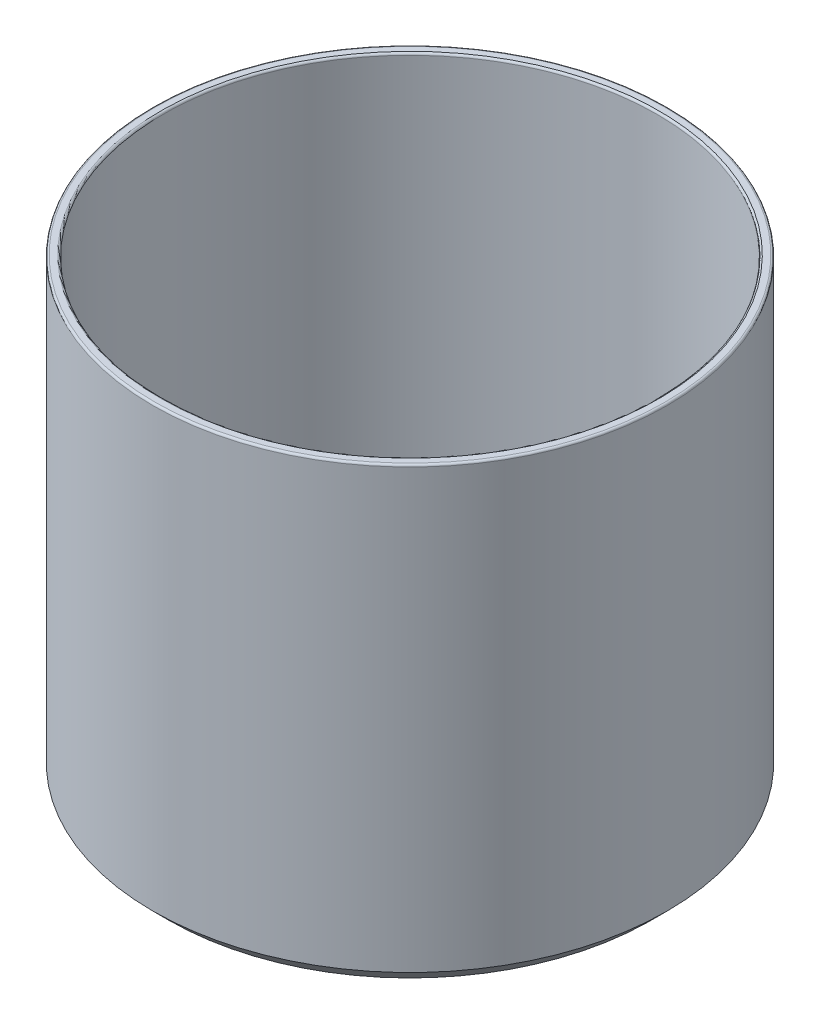
ISO-10303-21;
HEADER;
FILE_DESCRIPTION(('STEP AP214'),'2;1');
FILE_NAME('part.step','',(''),(''),'','','');
FILE_SCHEMA(('AUTOMOTIVE_DESIGN { 1 0 10303 214 1 1 1 1 }'));
ENDSEC;
DATA;
#1=APPLICATION_CONTEXT('core data for automotive mechanical design processes');
#2=APPLICATION_PROTOCOL_DEFINITION('international standard','automotive_design',2000,#1);
#3=PRODUCT_CONTEXT('',#1,'mechanical');
#4=PRODUCT('Part','Part','',(#3));
#5=PRODUCT_RELATED_PRODUCT_CATEGORY('part','',(#4));
#6=PRODUCT_DEFINITION_FORMATION('','',#4);
#7=PRODUCT_DEFINITION_CONTEXT('part definition',#1,'design');
#8=PRODUCT_DEFINITION('design','',#6,#7);
#9=PRODUCT_DEFINITION_SHAPE('','',#8);
#10=(LENGTH_UNIT() NAMED_UNIT(*) SI_UNIT(.MILLI.,.METRE.));
#11=(NAMED_UNIT(*) PLANE_ANGLE_UNIT() SI_UNIT($,.RADIAN.));
#12=(NAMED_UNIT(*) SI_UNIT($,.STERADIAN.) SOLID_ANGLE_UNIT());
#13=UNCERTAINTY_MEASURE_WITH_UNIT(LENGTH_MEASURE(1.E-05),#10,'distance_accuracy_value','');
#14=(GEOMETRIC_REPRESENTATION_CONTEXT(3) GLOBAL_UNCERTAINTY_ASSIGNED_CONTEXT((#13)) GLOBAL_UNIT_ASSIGNED_CONTEXT((#10,
#11,#12)) REPRESENTATION_CONTEXT('',''));
#15=CARTESIAN_POINT('',(0.,0.,0.));
#16=DIRECTION('',(0.,0.,1.));
#17=DIRECTION('',(1.,0.,0.));
#18=AXIS2_PLACEMENT_3D('',#15,#16,#17);
#19=CARTESIAN_POINT('',(0.,6.,0.));
#20=DIRECTION('',(0.,-1.,0.));
#21=DIRECTION('',(0.,0.,-1.));
#22=AXIS2_PLACEMENT_3D('',#19,#20,#21);
#23=CYLINDRICAL_SURFACE('',#22,127.5);
#24=CARTESIAN_POINT('',(0.,225.,0.));
#25=DIRECTION('',(0.,1.,0.));
#26=DIRECTION('',(0.,0.,1.));
#27=AXIS2_PLACEMENT_3D('',#24,#25,#26);
#28=CIRCLE('',#27,127.5);
#29=CARTESIAN_POINT('',(0.,225.,127.5));
#30=VERTEX_POINT('',#29);
#31=EDGE_CURVE('E58',#30,#30,#28,.F.);
#32=ORIENTED_EDGE('',*,*,#31,.T.);
#33=EDGE_LOOP('',(#32));
#34=FACE_BOUND('',#33,.T.);
#35=CARTESIAN_POINT('',(0.,8.00000000000001,0.));
#36=DIRECTION('',(0.,1.,0.));
#37=DIRECTION('',(0.,0.,1.));
#38=AXIS2_PLACEMENT_3D('',#35,#36,#37);
#39=CIRCLE('',#38,127.5);
#40=CARTESIAN_POINT('',(0.,8.00000000000001,127.5));
#41=VERTEX_POINT('',#40);
#42=EDGE_CURVE('E70',#41,#41,#39,.T.);
#43=ORIENTED_EDGE('',*,*,#42,.T.);
#44=EDGE_LOOP('',(#43));
#45=FACE_BOUND('',#44,.T.);
#46=ADVANCED_FACE('F35',(#34,#45),#23,.T.);
#47=CARTESIAN_POINT('',(0.,0.,0.));
#48=DIRECTION('',(0.,1.,0.));
#49=DIRECTION('',(0.,0.,1.));
#50=AXIS2_PLACEMENT_3D('',#47,#48,#49);
#51=PLANE('',#50);
#52=CARTESIAN_POINT('',(0.,0.,0.));
#53=DIRECTION('',(0.,1.,0.));
#54=DIRECTION('',(0.,0.,1.));
#55=AXIS2_PLACEMENT_3D('',#52,#53,#54);
#56=CIRCLE('',#55,11.);
#57=CARTESIAN_POINT('',(0.,0.,11.));
#58=VERTEX_POINT('',#57);
#59=EDGE_CURVE('E50',#58,#58,#56,.T.);
#60=ORIENTED_EDGE('',*,*,#59,.T.);
#61=EDGE_LOOP('',(#60));
#62=FACE_BOUND('',#61,.T.);
#63=CARTESIAN_POINT('',(0.,0.,0.));
#64=DIRECTION('',(0.,1.,0.));
#65=DIRECTION('',(0.,0.,1.));
#66=AXIS2_PLACEMENT_3D('',#63,#64,#65);
#67=CIRCLE('',#66,119.5);
#68=CARTESIAN_POINT('',(0.,0.,119.5));
#69=VERTEX_POINT('',#68);
#70=EDGE_CURVE('E67',#69,#69,#67,.F.);
#71=ORIENTED_EDGE('',*,*,#70,.T.);
#72=EDGE_LOOP('',(#71));
#73=FACE_BOUND('',#72,.T.);
#74=ADVANCED_FACE('F100',(#62,#73),#51,.F.);
#75=CARTESIAN_POINT('',(0.,226.,0.));
#76=DIRECTION('',(0.,1.,0.));
#77=DIRECTION('',(0.,0.,1.));
#78=AXIS2_PLACEMENT_3D('',#75,#76,#77);
#79=PLANE('',#78);
#80=CARTESIAN_POINT('',(0.,226.,0.));
#81=DIRECTION('',(0.,1.,0.));
#82=DIRECTION('',(0.,0.,1.));
#83=AXIS2_PLACEMENT_3D('',#80,#81,#82);
#84=CIRCLE('',#83,126.5);
#85=CARTESIAN_POINT('',(0.,226.,126.5));
#86=VERTEX_POINT('',#85);
#87=EDGE_CURVE('E61',#86,#86,#84,.T.);
#88=ORIENTED_EDGE('',*,*,#87,.T.);
#89=EDGE_LOOP('',(#88));
#90=FACE_BOUND('',#89,.T.);
#91=CARTESIAN_POINT('',(0.,226.,0.));
#92=DIRECTION('',(0.,1.,0.));
#93=DIRECTION('',(0.,0.,1.));
#94=AXIS2_PLACEMENT_3D('',#91,#92,#93);
#95=CIRCLE('',#94,123.5);
#96=CARTESIAN_POINT('',(0.,226.,123.5));
#97=VERTEX_POINT('',#96);
#98=EDGE_CURVE('E64',#97,#97,#95,.F.);
#99=ORIENTED_EDGE('',*,*,#98,.T.);
#100=EDGE_LOOP('',(#99));
#101=FACE_BOUND('',#100,.T.);
#102=ADVANCED_FACE('F105',(#90,#101),#79,.T.);
#103=CARTESIAN_POINT('',(0.,226.,0.));
#104=DIRECTION('',(0.,-1.,0.));
#105=DIRECTION('',(0.,0.,-1.));
#106=AXIS2_PLACEMENT_3D('',#103,#104,#105);
#107=CYLINDRICAL_SURFACE('',#106,122.5);
#108=CARTESIAN_POINT('',(0.,225.,0.));
#109=DIRECTION('',(0.,1.,0.));
#110=DIRECTION('',(0.,0.,1.));
#111=AXIS2_PLACEMENT_3D('',#108,#109,#110);
#112=CIRCLE('',#111,122.5);
#113=CARTESIAN_POINT('',(0.,225.,122.5));
#114=VERTEX_POINT('',#113);
#115=EDGE_CURVE('E55',#114,#114,#112,.T.);
#116=ORIENTED_EDGE('',*,*,#115,.T.);
#117=EDGE_LOOP('',(#116));
#118=FACE_BOUND('',#117,.T.);
#119=CARTESIAN_POINT('',(0.,16.,0.));
#120=DIRECTION('',(0.,1.,0.));
#121=DIRECTION('',(0.,0.,1.));
#122=AXIS2_PLACEMENT_3D('',#119,#120,#121);
#123=CIRCLE('',#122,122.5);
#124=CARTESIAN_POINT('',(0.,16.,122.5));
#125=VERTEX_POINT('',#124);
#126=EDGE_CURVE('E76',#125,#125,#123,.F.);
#127=ORIENTED_EDGE('',*,*,#126,.T.);
#128=EDGE_LOOP('',(#127));
#129=FACE_BOUND('',#128,.T.);
#130=ADVANCED_FACE('F80',(#118,#129),#107,.F.);
#131=CARTESIAN_POINT('',(0.,6.,0.));
#132=DIRECTION('',(0.,1.,0.));
#133=DIRECTION('',(0.,0.,1.));
#134=AXIS2_PLACEMENT_3D('',#131,#132,#133);
#135=PLANE('',#134);
#136=CARTESIAN_POINT('',(0.,6.,0.));
#137=DIRECTION('',(0.,1.,0.));
#138=DIRECTION('',(0.,0.,1.));
#139=AXIS2_PLACEMENT_3D('',#136,#137,#138);
#140=CIRCLE('',#139,11.);
#141=CARTESIAN_POINT('',(0.,6.,11.));
#142=VERTEX_POINT('',#141);
#143=EDGE_CURVE('E10',#142,#142,#140,.F.);
#144=ORIENTED_EDGE('',*,*,#143,.T.);
#145=EDGE_LOOP('',(#144));
#146=FACE_BOUND('',#145,.T.);
#147=CARTESIAN_POINT('',(0.,6.,0.));
#148=DIRECTION('',(0.,1.,0.));
#149=DIRECTION('',(0.,0.,1.));
#150=AXIS2_PLACEMENT_3D('',#147,#148,#149);
#151=CIRCLE('',#150,112.5);
#152=CARTESIAN_POINT('',(0.,6.,112.5));
#153=VERTEX_POINT('',#152);
#154=EDGE_CURVE('E73',#153,#153,#151,.T.);
#155=ORIENTED_EDGE('',*,*,#154,.T.);
#156=EDGE_LOOP('',(#155));
#157=FACE_BOUND('',#156,.T.);
#158=ADVANCED_FACE('F95',(#146,#157),#135,.T.);
#159=CARTESIAN_POINT('',(0.,-194.,0.));
#160=DIRECTION('',(0.,1.,0.));
#161=DIRECTION('',(0.,0.,1.));
#162=AXIS2_PLACEMENT_3D('',#159,#160,#161);
#163=CYLINDRICAL_SURFACE('',#162,10.);
#164=CARTESIAN_POINT('',(0.,5.,0.));
#165=DIRECTION('',(0.,1.,0.));
#166=DIRECTION('',(0.,0.,1.));
#167=AXIS2_PLACEMENT_3D('',#164,#165,#166);
#168=CIRCLE('',#167,10.);
#169=CARTESIAN_POINT('',(0.,5.,10.));
#170=VERTEX_POINT('',#169);
#171=EDGE_CURVE('E42',#170,#170,#168,.T.);
#172=ORIENTED_EDGE('',*,*,#171,.T.);
#173=EDGE_LOOP('',(#172));
#174=FACE_BOUND('',#173,.T.);
#175=CARTESIAN_POINT('',(0.,1.00000000000003,0.));
#176=DIRECTION('',(0.,1.,0.));
#177=DIRECTION('',(0.,0.,1.));
#178=AXIS2_PLACEMENT_3D('',#175,#176,#177);
#179=CIRCLE('',#178,10.);
#180=CARTESIAN_POINT('',(0.,1.00000000000003,10.));
#181=VERTEX_POINT('',#180);
#182=EDGE_CURVE('E46',#181,#181,#179,.F.);
#183=ORIENTED_EDGE('',*,*,#182,.T.);
#184=EDGE_LOOP('',(#183));
#185=FACE_BOUND('',#184,.T.);
#186=ADVANCED_FACE('F85',(#174,#185),#163,.F.);
#187=CARTESIAN_POINT('',(0.,16.,0.));
#188=DIRECTION('',(0.,1.,0.));
#189=DIRECTION('',(0.,0.,1.));
#190=AXIS2_PLACEMENT_3D('',#187,#188,#189);
#191=TOROIDAL_SURFACE('',#190,112.5,10.);
#192=ORIENTED_EDGE('',*,*,#154,.F.);
#193=EDGE_LOOP('',(#192));
#194=FACE_BOUND('',#193,.T.);
#195=ORIENTED_EDGE('',*,*,#126,.F.);
#196=EDGE_LOOP('',(#195));
#197=FACE_BOUND('',#196,.T.);
#198=ADVANCED_FACE('F82',(#194,#197),#191,.F.);
#199=CARTESIAN_POINT('',(0.,8.00000000000001,0.));
#200=DIRECTION('',(0.,1.,0.));
#201=DIRECTION('',(0.,0.,1.));
#202=AXIS2_PLACEMENT_3D('',#199,#200,#201);
#203=CONICAL_SURFACE('',#202,127.5,0.785398163397448);
#204=ORIENTED_EDGE('',*,*,#70,.F.);
#205=EDGE_LOOP('',(#204));
#206=FACE_BOUND('',#205,.T.);
#207=ORIENTED_EDGE('',*,*,#42,.F.);
#208=EDGE_LOOP('',(#207));
#209=FACE_BOUND('',#208,.T.);
#210=ADVANCED_FACE('F84',(#206,#209),#203,.T.);
#211=CARTESIAN_POINT('',(0.,225.,0.));
#212=DIRECTION('',(0.,1.,0.));
#213=DIRECTION('',(0.,0.,1.));
#214=AXIS2_PLACEMENT_3D('',#211,#212,#213);
#215=TOROIDAL_SURFACE('',#214,126.5,1.);
#216=ORIENTED_EDGE('',*,*,#31,.F.);
#217=EDGE_LOOP('',(#216));
#218=FACE_BOUND('',#217,.T.);
#219=ORIENTED_EDGE('',*,*,#87,.F.);
#220=EDGE_LOOP('',(#219));
#221=FACE_BOUND('',#220,.T.);
#222=ADVANCED_FACE('F92',(#218,#221),#215,.T.);
#223=CARTESIAN_POINT('',(0.,225.,0.));
#224=DIRECTION('',(0.,1.,0.));
#225=DIRECTION('',(0.,0.,1.));
#226=AXIS2_PLACEMENT_3D('',#223,#224,#225);
#227=TOROIDAL_SURFACE('',#226,123.5,1.);
#228=ORIENTED_EDGE('',*,*,#98,.F.);
#229=EDGE_LOOP('',(#228));
#230=FACE_BOUND('',#229,.T.);
#231=ORIENTED_EDGE('',*,*,#115,.F.);
#232=EDGE_LOOP('',(#231));
#233=FACE_BOUND('',#232,.T.);
#234=ADVANCED_FACE('F121',(#230,#233),#227,.T.);
#235=CARTESIAN_POINT('',(0.,0.,0.));
#236=DIRECTION('',(0.,-1.,0.));
#237=DIRECTION('',(0.,0.,-1.));
#238=AXIS2_PLACEMENT_3D('',#235,#236,#237);
#239=CONICAL_SURFACE('',#238,11.,0.785398163397439);
#240=ORIENTED_EDGE('',*,*,#182,.F.);
#241=EDGE_LOOP('',(#240));
#242=FACE_BOUND('',#241,.T.);
#243=ORIENTED_EDGE('',*,*,#59,.F.);
#244=EDGE_LOOP('',(#243));
#245=FACE_BOUND('',#244,.T.);
#246=ADVANCED_FACE('F123',(#242,#245),#239,.F.);
#247=CARTESIAN_POINT('',(0.,5.,0.));
#248=DIRECTION('',(0.,1.,0.));
#249=DIRECTION('',(0.,0.,1.));
#250=AXIS2_PLACEMENT_3D('',#247,#248,#249);
#251=TOROIDAL_SURFACE('',#250,11.,1.);
#252=ORIENTED_EDGE('',*,*,#143,.F.);
#253=EDGE_LOOP('',(#252));
#254=FACE_BOUND('',#253,.T.);
#255=ORIENTED_EDGE('',*,*,#171,.F.);
#256=EDGE_LOOP('',(#255));
#257=FACE_BOUND('',#256,.T.);
#258=ADVANCED_FACE('F37',(#254,#257),#251,.T.);
#259=CLOSED_SHELL('',(#46,#74,#102,#130,#158,#186,#198,#210,#222,#234,#246,#258));
#260=MANIFOLD_SOLID_BREP('B2',#259);
#261=ADVANCED_BREP_SHAPE_REPRESENTATION('',(#18,#260),#14);
#262=SHAPE_DEFINITION_REPRESENTATION(#9,#261);
ENDSEC;
END-ISO-10303-21;
